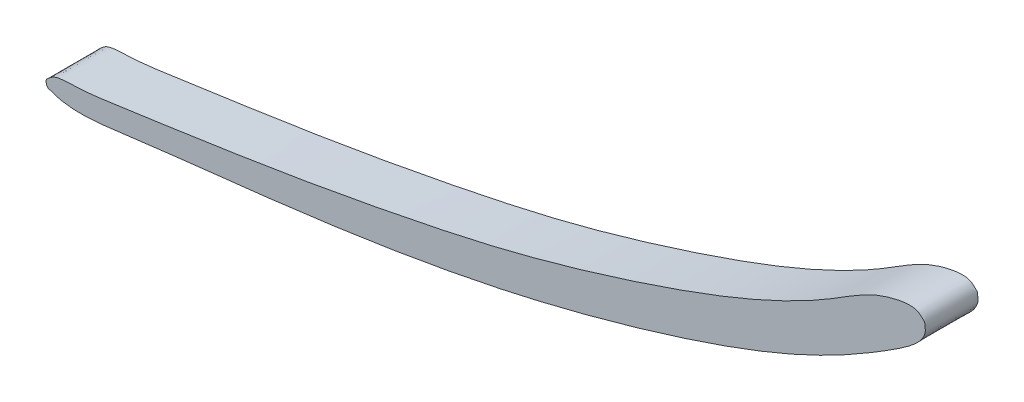
ISO-10303-21;
HEADER;
FILE_DESCRIPTION(('STEP AP214'),'2;1');
FILE_NAME('part.step','',(''),(''),'','','');
FILE_SCHEMA(('AUTOMOTIVE_DESIGN { 1 0 10303 214 1 1 1 1 }'));
ENDSEC;
DATA;
#1=APPLICATION_CONTEXT('core data for automotive mechanical design processes');
#2=APPLICATION_PROTOCOL_DEFINITION('international standard','automotive_design',2000,#1);
#3=PRODUCT_CONTEXT('',#1,'mechanical');
#4=PRODUCT('Part','Part','',(#3));
#5=PRODUCT_RELATED_PRODUCT_CATEGORY('part','',(#4));
#6=PRODUCT_DEFINITION_FORMATION('','',#4);
#7=PRODUCT_DEFINITION_CONTEXT('part definition',#1,'design');
#8=PRODUCT_DEFINITION('design','',#6,#7);
#9=PRODUCT_DEFINITION_SHAPE('','',#8);
#10=(LENGTH_UNIT() NAMED_UNIT(*) SI_UNIT(.MILLI.,.METRE.));
#11=(NAMED_UNIT(*) PLANE_ANGLE_UNIT() SI_UNIT($,.RADIAN.));
#12=(NAMED_UNIT(*) SI_UNIT($,.STERADIAN.) SOLID_ANGLE_UNIT());
#13=UNCERTAINTY_MEASURE_WITH_UNIT(LENGTH_MEASURE(1.E-05),#10,'distance_accuracy_value','');
#14=(GEOMETRIC_REPRESENTATION_CONTEXT(3) GLOBAL_UNCERTAINTY_ASSIGNED_CONTEXT((#13)) GLOBAL_UNIT_ASSIGNED_CONTEXT((#10,
#11,#12)) REPRESENTATION_CONTEXT('',''));
#15=CARTESIAN_POINT('',(0.,0.,0.));
#16=DIRECTION('',(0.,0.,1.));
#17=DIRECTION('',(1.,0.,0.));
#18=AXIS2_PLACEMENT_3D('',#15,#16,#17);
#19=CARTESIAN_POINT('',(80.3681662930312,0.,324.));
#20=CARTESIAN_POINT('',(80.3332922161662,0.0879752940058576,324.));
#21=CARTESIAN_POINT('',(80.2685826506996,0.156845551200729,324.));
#22=CARTESIAN_POINT('',(80.1343495821701,0.286544346547012,324.));
#23=CARTESIAN_POINT('',(80.0634697382039,0.347234187714516,324.));
#24=CARTESIAN_POINT('',(79.8547067438405,0.533588417553242,324.));
#25=CARTESIAN_POINT('',(79.7161343589074,0.660130375545312,324.));
#26=CARTESIAN_POINT('',(79.4906524435037,0.822556149189074,324.));
#27=CARTESIAN_POINT('',(79.4129908654656,0.87252916410502,324.));
#28=CARTESIAN_POINT('',(79.2485978659326,0.957356332931109,324.));
#29=CARTESIAN_POINT('',(79.1614047273396,0.992863665723763,324.));
#30=CARTESIAN_POINT('',(78.8937661149337,1.07901747163807,324.));
#31=CARTESIAN_POINT('',(78.7109322519051,1.10914701907117,324.));
#32=CARTESIAN_POINT('',(78.3409909899485,1.14293348736234,324.));
#33=CARTESIAN_POINT('',(78.1534366725936,1.14575699868746,324.));
#34=CARTESIAN_POINT('',(77.7826684676746,1.13765948760862,324.));
#35=CARTESIAN_POINT('',(77.5983165901293,1.12625628658208,324.));
#36=CARTESIAN_POINT('',(77.0480254796304,1.07234988382803,324.));
#37=CARTESIAN_POINT('',(76.684617642929,1.01181086889114,324.));
#38=CARTESIAN_POINT('',(75.9611166867751,0.867115982869691,324.));
#39=CARTESIAN_POINT('',(75.6002446763123,0.781156071941636,324.));
#40=CARTESIAN_POINT('',(74.8868480962219,0.587162028949001,324.));
#41=CARTESIAN_POINT('',(74.5348582527314,0.479774051609013,324.));
#42=CARTESIAN_POINT('',(73.4920898920143,0.128476780087926,324.));
#43=CARTESIAN_POINT('',(72.814993442137,-0.145627134765617,324.));
#44=CARTESIAN_POINT('',(70.835888140254,-1.08310258132398,324.));
#45=CARTESIAN_POINT('',(69.5812760274827,-1.85117373523442,324.));
#46=CARTESIAN_POINT('',(67.7074331691984,-3.02070546748365,324.));
#47=CARTESIAN_POINT('',(67.083529409527,-3.41209592928973,324.));
#48=CARTESIAN_POINT('',(65.828739713028,-4.17967925700701,324.));
#49=CARTESIAN_POINT('',(65.1984123778196,-4.55708799033158,324.));
#50=CARTESIAN_POINT('',(63.2916215948873,-5.65490437747468,324.));
#51=CARTESIAN_POINT('',(62.000130566435,-6.3426025920934,324.));
#52=CARTESIAN_POINT('',(59.3905309068326,-7.66006242642342,324.));
#53=CARTESIAN_POINT('',(58.0725258606504,-8.29004951198109,324.));
#54=CARTESIAN_POINT('',(55.4170246863835,-9.50759886635779,324.));
#55=CARTESIAN_POINT('',(54.0789451314043,-10.093891232397,324.));
#56=CARTESIAN_POINT('',(51.3822708672398,-11.2218221242261,324.));
#57=CARTESIAN_POINT('',(50.0240429664722,-11.7642590551518,324.));
#58=CARTESIAN_POINT('',(45.9264215446745,-13.3416429864623,324.));
#59=CARTESIAN_POINT('',(43.1646554326539,-14.329320211329,324.));
#60=CARTESIAN_POINT('',(37.6072340338468,-16.224900640075,324.));
#61=CARTESIAN_POINT('',(34.8139043640364,-17.1294820956699,324.));
#62=CARTESIAN_POINT('',(29.2054878147714,-18.8664425008462,324.));
#63=CARTESIAN_POINT('',(26.390843334939,-19.6985852392419,324.));
#64=CARTESIAN_POINT('',(20.7340633738239,-21.2671507429504,324.));
#65=CARTESIAN_POINT('',(17.8907561469061,-22.0028421256199,324.));
#66=CARTESIAN_POINT('',(12.181195972912,-23.3683627313171,324.));
#67=CARTESIAN_POINT('',(9.31514909595396,-24.0012788723005,324.));
#68=CARTESIAN_POINT('',(3.56897091598708,-25.2048017995811,324.));
#69=CARTESIAN_POINT('',(0.689295256648165,-25.7771257272051,324.));
#70=CARTESIAN_POINT('',(-5.07578044485798,-26.8878264918017,324.));
#71=CARTESIAN_POINT('',(-7.9623199888897,-27.4220620260696,324.));
#72=CARTESIAN_POINT('',(-13.7438504537859,-28.4459395875459,324.));
#73=CARTESIAN_POINT('',(-16.6388382823,-28.9327808597916,324.));
#74=CARTESIAN_POINT('',(-22.4358556841405,-29.8619517774227,324.));
#75=CARTESIAN_POINT('',(-25.3380656389695,-30.3038534363204,324.));
#76=CARTESIAN_POINT('',(-31.1458186134143,-31.1660498356122,324.));
#77=CARTESIAN_POINT('',(-34.0508875000237,-31.5890901024617,324.));
#78=CARTESIAN_POINT('',(-38.4094344310781,-32.217068841772,324.));
#79=CARTESIAN_POINT('',(-39.8624200295712,-32.4254538094014,324.));
#80=CARTESIAN_POINT('',(-42.0429693381293,-32.730451712722,324.));
#81=CARTESIAN_POINT('',(-42.7699651533263,-32.8310774784897,324.));
#82=CARTESIAN_POINT('',(-44.2241455226802,-33.0308727691224,324.));
#83=CARTESIAN_POINT('',(-44.9512064674475,-33.1309898063176,324.));
#84=CARTESIAN_POINT('',(-46.4093220283049,-33.3012587041316,324.));
#85=CARTESIAN_POINT('',(-47.1396586460287,-33.36973626199,324.));
#86=CARTESIAN_POINT('',(-48.2374412154866,-33.435870722634,324.));
#87=CARTESIAN_POINT('',(-48.6038238093206,-33.451005608214,324.));
#88=CARTESIAN_POINT('',(-49.3371941739843,-33.4720861838169,324.));
#89=CARTESIAN_POINT('',(-49.7043069667104,-33.4800332987999,324.));
#90=CARTESIAN_POINT('',(-50.4349606029914,-33.5251308070532,324.));
#91=CARTESIAN_POINT('',(-50.7988536005882,-33.5587103927075,324.));
#92=CARTESIAN_POINT('',(-51.3371587768028,-33.6670436614103,324.));
#93=CARTESIAN_POINT('',(-51.5170483865823,-33.7141380678849,324.));
#94=CARTESIAN_POINT('',(-51.862740245526,-33.840635048823,324.));
#95=CARTESIAN_POINT('',(-52.0267672836615,-33.9207440161551,324.));
#96=CARTESIAN_POINT('',(-52.336298539798,-34.1163749713912,324.));
#97=CARTESIAN_POINT('',(-52.483245168705,-34.2299052987435,324.));
#98=CARTESIAN_POINT('',(-52.6951944499742,-34.4087422892785,324.));
#99=CARTESIAN_POINT('',(-52.7662184858779,-34.4681309179263,324.));
#100=CARTESIAN_POINT('',(-52.9017899446751,-34.5933582177269,324.));
#101=CARTESIAN_POINT('',(-52.9693275146866,-34.6591509051646,324.));
#102=CARTESIAN_POINT('',(-53.0397011329861,-34.7781004947824,324.));
#103=CARTESIAN_POINT('',(-53.0568998238589,-34.8214991152693,324.));
#104=CARTESIAN_POINT('',(-53.0752367944463,-34.9128045498878,324.));
#105=CARTESIAN_POINT('',(-53.0772110961267,-34.9590074080593,324.));
#106=CARTESIAN_POINT('',(-53.0700520852565,-35.0986163596678,324.));
#107=CARTESIAN_POINT('',(-53.0501186870425,-35.1885223576265,324.));
#108=CARTESIAN_POINT('',(-53.0044100800903,-35.366151345376,324.));
#109=CARTESIAN_POINT('',(-52.9780078866022,-35.4550519163809,324.));
#110=CARTESIAN_POINT('',(-52.9146457609342,-35.5791521138046,324.));
#111=CARTESIAN_POINT('',(-52.889385150171,-35.6175502005167,324.));
#112=CARTESIAN_POINT('',(-52.8274541247658,-35.6861646188563,324.));
#113=CARTESIAN_POINT('',(-52.790721774627,-35.716219442193,324.));
#114=CARTESIAN_POINT('',(-52.6720203580192,-35.7859371658669,324.));
#115=CARTESIAN_POINT('',(-52.5809921650868,-35.8113156936606,324.));
#116=CARTESIAN_POINT('',(-52.4021842439574,-35.8620029256775,324.));
#117=CARTESIAN_POINT('',(-52.3130656321725,-35.8882278010575,324.));
#118=CARTESIAN_POINT('',(-52.0473341814662,-35.9719001310282,324.));
#119=CARTESIAN_POINT('',(-51.8726061466316,-36.0353617763469,324.));
#120=CARTESIAN_POINT('',(-51.5217203350962,-36.1569257415733,324.));
#121=CARTESIAN_POINT('',(-51.3456252308135,-36.2142328810324,324.));
#122=CARTESIAN_POINT('',(-50.9899638416216,-36.3103530849745,324.));
#123=CARTESIAN_POINT('',(-50.8106446882763,-36.3504828397036,324.));
#124=CARTESIAN_POINT('',(-50.2697115768245,-36.4550181549565,324.));
#125=CARTESIAN_POINT('',(-49.9049597539345,-36.5027055112696,324.));
#126=CARTESIAN_POINT('',(-49.1714250150643,-36.5766029958653,324.));
#127=CARTESIAN_POINT('',(-48.8017562033366,-36.6010113649196,324.));
#128=CARTESIAN_POINT('',(-47.6965991413182,-36.6396246998774,324.));
#129=CARTESIAN_POINT('',(-46.9618035114793,-36.618548757223,324.));
#130=CARTESIAN_POINT('',(-45.4943592108035,-36.5255215357745,324.));
#131=CARTESIAN_POINT('',(-44.7616250475714,-36.4555961244215,324.));
#132=CARTESIAN_POINT('',(-43.2970081274269,-36.2955699827349,324.));
#133=CARTESIAN_POINT('',(-42.5658246242849,-36.2056525477358,324.));
#134=CARTESIAN_POINT('',(-41.1039748982247,-36.0220717034061,324.));
#135=CARTESIAN_POINT('',(-40.3733946400649,-35.9274456491954,324.));
#136=CARTESIAN_POINT('',(-38.1813494517993,-35.6460842263817,324.));
#137=CARTESIAN_POINT('',(-36.7194953490411,-35.4625079932191,324.));
#138=CARTESIAN_POINT('',(-32.331335117484,-34.9329486663179,324.));
#139=CARTESIAN_POINT('',(-29.4027184330754,-34.6058566094856,324.));
#140=CARTESIAN_POINT('',(-23.5463158028321,-33.9451493866262,324.));
#141=CARTESIAN_POINT('',(-20.6185997503662,-33.6107132097997,324.));
#142=CARTESIAN_POINT('',(-14.768360770631,-32.8981505515783,324.));
#143=CARTESIAN_POINT('',(-11.8453671730002,-32.5208993957451,324.));
#144=CARTESIAN_POINT('',(-6.00833102389001,-31.7085965130094,324.));
#145=CARTESIAN_POINT('',(-3.09453196719177,-31.2726363077874,324.));
#146=CARTESIAN_POINT('',(5.63070337810566,-29.86266580108,324.));
#147=CARTESIAN_POINT('',(11.4281250398305,-28.7830128786137,324.));
#148=CARTESIAN_POINT('',(22.9387458067389,-26.2662408112458,324.));
#149=CARTESIAN_POINT('',(28.6567654231321,-24.8261455210969,324.));
#150=CARTESIAN_POINT('',(37.1621023664273,-22.4127277123044,324.));
#151=CARTESIAN_POINT('',(39.9858662121887,-21.566534693519,324.));
#152=CARTESIAN_POINT('',(45.6013487391972,-19.7854028903357,324.));
#153=CARTESIAN_POINT('',(48.39366288189,-18.8495857300987,324.));
#154=CARTESIAN_POINT('',(53.933056900862,-16.8452690047786,324.));
#155=CARTESIAN_POINT('',(56.682956029596,-15.7752787279938,324.));
#156=CARTESIAN_POINT('',(60.7419205317758,-14.0230223255074,324.));
#157=CARTESIAN_POINT('',(62.0839363203909,-13.4144113752521,324.));
#158=CARTESIAN_POINT('',(64.7429876400676,-12.1413535536193,324.));
#159=CARTESIAN_POINT('',(66.0601496706636,-11.4766949439121,324.));
#160=CARTESIAN_POINT('',(69.9643521814461,-9.39932650419335,324.));
#161=CARTESIAN_POINT('',(72.5079707932433,-7.901748818133,324.));
#162=CARTESIAN_POINT('',(75.6179662304141,-5.92203839335221,324.));
#163=CARTESIAN_POINT('',(76.2366504197336,-5.52079672757025,324.));
#164=CARTESIAN_POINT('',(77.1512600958639,-4.89875967899628,324.));
#165=CARTESIAN_POINT('',(77.4531976675691,-4.68737535863853,324.));
#166=CARTESIAN_POINT('',(78.0470608526542,-4.25081740922675,324.));
#167=CARTESIAN_POINT('',(78.3402590862171,-4.02583766722541,324.));
#168=CARTESIAN_POINT('',(78.9027989005038,-3.55159480384488,324.));
#169=CARTESIAN_POINT('',(79.1718272920894,-3.30256429455625,324.));
#170=CARTESIAN_POINT('',(79.5442062190221,-2.89870116928513,324.));
#171=CARTESIAN_POINT('',(79.663007177274,-2.7588993952298,324.));
#172=CARTESIAN_POINT('',(79.8863202996661,-2.46539508809473,324.));
#173=CARTESIAN_POINT('',(79.9910601501322,-2.31076172971561,324.));
#174=CARTESIAN_POINT('',(80.1795798619596,-1.99181153025727,324.));
#175=CARTESIAN_POINT('',(80.2640114745223,-1.82709426397243,324.));
#176=CARTESIAN_POINT('',(80.3979997175953,-1.47905819112557,324.));
#177=CARTESIAN_POINT('',(80.4464176781137,-1.30058264660064,324.));
#178=CARTESIAN_POINT('',(80.4682263139599,-1.02311729095879,324.));
#179=CARTESIAN_POINT('',(80.4662307478287,-0.928663852298156,324.));
#180=CARTESIAN_POINT('',(80.4529753658955,-0.742312433086723,324.));
#181=CARTESIAN_POINT('',(80.4415279279687,-0.649605732720179,324.));
#182=CARTESIAN_POINT('',(80.4209300988431,-0.463968806530826,324.));
#183=CARTESIAN_POINT('',(80.4146200493684,-0.370762187253792,324.));
#184=CARTESIAN_POINT('',(80.4069908633904,-0.230773608182732,324.));
#185=CARTESIAN_POINT('',(80.4048756577256,-0.18406911382309,324.));
#186=CARTESIAN_POINT('',(80.3945165705414,-0.0912565061219816,324.));
#187=CARTESIAN_POINT('',(80.3856033314636,-0.0439876470029203,324.));
#188=CARTESIAN_POINT('',(80.3681662930312,0.,324.));
#189=B_SPLINE_CURVE_WITH_KNOTS('',3,(#19,#20,#21,#22,#23,#24,#25,#26,#27,#28,#29,#30,#31,#32,
#33,#34,#35,#36,#37,#38,#39,#40,#41,#42,#43,#44,#45,#46,#47,#48,#49,#50,#51,#52,#53,#54,#55,#56,
#57,#58,#59,#60,#61,#62,#63,#64,#65,#66,#67,#68,#69,#70,#71,#72,#73,#74,#75,#76,#77,#78,#79,#80,
#81,#82,#83,#84,#85,#86,#87,#88,#89,#90,#91,#92,#93,#94,#95,#96,#97,#98,#99,#100,#101,#102,#103,
#104,#105,#106,#107,#108,#109,#110,#111,#112,#113,#114,#115,#116,#117,#118,#119,#120,#121,#122,
#123,#124,#125,#126,#127,#128,#129,#130,#131,#132,#133,#134,#135,#136,#137,#138,#139,#140,#141,
#142,#143,#144,#145,#146,#147,#148,#149,#150,#151,#152,#153,#154,#155,#156,#157,#158,#159,#160,
#161,#162,#163,#164,#165,#166,#167,#168,#169,#170,#171,#172,#173,#174,#175,#176,#177,#178,#179,
#180,#181,#182,#183,#184,#185,#186,#187,#188),.UNSPECIFIED.,.T.,.F.,(4,2,2,2,2,2,2,2,2,2,2,2,2,
2,2,2,2,2,2,2,2,2,2,2,2,2,2,2,2,2,2,2,2,2,2,2,2,2,2,2,2,2,2,2,2,2,2,2,2,2,2,2,2,2,2,2,2,2,2,2,2,
2,2,2,2,2,2,2,2,2,2,2,2,2,2,2,2,2,2,2,2,2,2,2,4),(0.,0.000976562499999912,0.00195312499999982,
0.00390624999999965,0.00488281249999962,0.00585937499999959,0.00781249999999954,
0.00976562499999948,0.0117187499999994,0.0156249999999995,0.0195312499999995,0.0234374999999995,
0.0312499999999997,0.0468750000000003,0.0546875000000006,0.062500000000001,0.0781250000000016,
0.0937500000000023,0.109375000000003,0.125000000000004,0.156250000000005,0.187500000000006,
0.218750000000008,0.250000000000009,0.281250000000011,0.312500000000012,0.343750000000014,
0.375000000000015,0.406250000000017,0.437500000000018,0.453125000000019,0.460937500000019,
0.468750000000019,0.47656250000002,0.48046875000002,0.48437500000002,0.48828125000002,
0.49023437500002,0.49218750000002,0.49414062500002,0.49511718750002,0.49609375000002,
0.49658203125002,0.49707031250002,0.49804687500002,0.49902343750002,0.49951171875002,
0.50000000000002,0.50097656250002,0.50195312500002,0.50390625000002,0.50585937500002,
0.50781250000002,0.51171875000002,0.51562500000002,0.523437500000019,0.531250000000019,
0.539062500000019,0.546875000000019,0.562500000000018,0.593750000000017,0.625000000000016,
0.656250000000014,0.687500000000013,0.75000000000001,0.812500000000008,0.843750000000007,
0.875000000000005,0.906250000000004,0.921875000000004,0.937500000000003,0.968750000000002,
0.976562500000001,0.980468750000001,0.984375000000001,0.98828125,0.990234375,0.9921875,
0.994140625,0.99609375,0.9970703125,0.998046875,0.9990234375,0.99951171875,1.),.UNSPECIFIED.);
#190=DIRECTION('',(0.,0.,-1.));
#191=VECTOR('',#190,1.);
#192=SURFACE_OF_LINEAR_EXTRUSION('',#189,#191);
#193=CARTESIAN_POINT('',(80.3681662930312,0.,324.));
#194=CARTESIAN_POINT('',(80.3856033314636,-0.0439876470029203,324.));
#195=CARTESIAN_POINT('',(80.3945165705414,-0.0912565061219816,324.));
#196=CARTESIAN_POINT('',(80.4048756577256,-0.18406911382309,324.));
#197=CARTESIAN_POINT('',(80.4069908633904,-0.230773608182732,324.));
#198=CARTESIAN_POINT('',(80.4146200493684,-0.370762187253792,324.));
#199=CARTESIAN_POINT('',(80.4209300988431,-0.463968806530826,324.));
#200=CARTESIAN_POINT('',(80.4415279279687,-0.649605732720179,324.));
#201=CARTESIAN_POINT('',(80.4529753658955,-0.742312433086723,324.));
#202=CARTESIAN_POINT('',(80.4662307478287,-0.928663852298156,324.));
#203=CARTESIAN_POINT('',(80.4682263139599,-1.02311729095879,324.));
#204=CARTESIAN_POINT('',(80.4464176781137,-1.30058264660064,324.));
#205=CARTESIAN_POINT('',(80.3979997175953,-1.47905819112557,324.));
#206=CARTESIAN_POINT('',(80.2640114745223,-1.82709426397243,324.));
#207=CARTESIAN_POINT('',(80.1795798619596,-1.99181153025727,324.));
#208=CARTESIAN_POINT('',(79.9910601501322,-2.31076172971561,324.));
#209=CARTESIAN_POINT('',(79.8863202996661,-2.46539508809473,324.));
#210=CARTESIAN_POINT('',(79.663007177274,-2.7588993952298,324.));
#211=CARTESIAN_POINT('',(79.5442062190221,-2.89870116928513,324.));
#212=CARTESIAN_POINT('',(79.1718272920894,-3.30256429455625,324.));
#213=CARTESIAN_POINT('',(78.9027989005038,-3.55159480384488,324.));
#214=CARTESIAN_POINT('',(78.3402590862171,-4.02583766722541,324.));
#215=CARTESIAN_POINT('',(78.0470608526542,-4.25081740922675,324.));
#216=CARTESIAN_POINT('',(77.4531976675691,-4.68737535863853,324.));
#217=CARTESIAN_POINT('',(77.1512600958639,-4.89875967899628,324.));
#218=CARTESIAN_POINT('',(76.2366504197336,-5.52079672757025,324.));
#219=CARTESIAN_POINT('',(75.6179662304141,-5.92203839335221,324.));
#220=CARTESIAN_POINT('',(72.5079707932433,-7.901748818133,324.));
#221=CARTESIAN_POINT('',(69.9643521814461,-9.39932650419335,324.));
#222=CARTESIAN_POINT('',(66.0601496706636,-11.4766949439121,324.));
#223=CARTESIAN_POINT('',(64.7429876400676,-12.1413535536193,324.));
#224=CARTESIAN_POINT('',(62.0839363203909,-13.4144113752521,324.));
#225=CARTESIAN_POINT('',(60.7419205317758,-14.0230223255074,324.));
#226=CARTESIAN_POINT('',(56.682956029596,-15.7752787279938,324.));
#227=CARTESIAN_POINT('',(53.933056900862,-16.8452690047786,324.));
#228=CARTESIAN_POINT('',(48.39366288189,-18.8495857300987,324.));
#229=CARTESIAN_POINT('',(45.6013487391972,-19.7854028903357,324.));
#230=CARTESIAN_POINT('',(39.9858662121887,-21.566534693519,324.));
#231=CARTESIAN_POINT('',(37.1621023664273,-22.4127277123044,324.));
#232=CARTESIAN_POINT('',(28.6567654231321,-24.8261455210969,324.));
#233=CARTESIAN_POINT('',(22.9387458067389,-26.2662408112458,324.));
#234=CARTESIAN_POINT('',(11.4281250398305,-28.7830128786137,324.));
#235=CARTESIAN_POINT('',(5.63070337810566,-29.86266580108,324.));
#236=CARTESIAN_POINT('',(-3.09453196719177,-31.2726363077874,324.));
#237=CARTESIAN_POINT('',(-6.00833102389001,-31.7085965130094,324.));
#238=CARTESIAN_POINT('',(-11.8453671730002,-32.5208993957451,324.));
#239=CARTESIAN_POINT('',(-14.768360770631,-32.8981505515783,324.));
#240=CARTESIAN_POINT('',(-20.6185997503662,-33.6107132097997,324.));
#241=CARTESIAN_POINT('',(-23.5463158028321,-33.9451493866262,324.));
#242=CARTESIAN_POINT('',(-29.4027184330754,-34.6058566094856,324.));
#243=CARTESIAN_POINT('',(-32.331335117484,-34.9329486663179,324.));
#244=CARTESIAN_POINT('',(-36.7194953490411,-35.4625079932191,324.));
#245=CARTESIAN_POINT('',(-38.1813494517993,-35.6460842263817,324.));
#246=CARTESIAN_POINT('',(-40.3733946400649,-35.9274456491954,324.));
#247=CARTESIAN_POINT('',(-41.1039748982247,-36.0220717034061,324.));
#248=CARTESIAN_POINT('',(-42.5658246242849,-36.2056525477358,324.));
#249=CARTESIAN_POINT('',(-43.2970081274269,-36.2955699827349,324.));
#250=CARTESIAN_POINT('',(-44.7616250475714,-36.4555961244215,324.));
#251=CARTESIAN_POINT('',(-45.4943592108035,-36.5255215357745,324.));
#252=CARTESIAN_POINT('',(-46.9618035114793,-36.618548757223,324.));
#253=CARTESIAN_POINT('',(-47.6965991413182,-36.6396246998774,324.));
#254=CARTESIAN_POINT('',(-48.8017562033366,-36.6010113649196,324.));
#255=CARTESIAN_POINT('',(-49.1714250150643,-36.5766029958653,324.));
#256=CARTESIAN_POINT('',(-49.9049597539345,-36.5027055112696,324.));
#257=CARTESIAN_POINT('',(-50.2697115768245,-36.4550181549565,324.));
#258=CARTESIAN_POINT('',(-50.8106446882763,-36.3504828397036,324.));
#259=CARTESIAN_POINT('',(-50.9899638416216,-36.3103530849745,324.));
#260=CARTESIAN_POINT('',(-51.3456252308135,-36.2142328810324,324.));
#261=CARTESIAN_POINT('',(-51.5217203350962,-36.1569257415733,324.));
#262=CARTESIAN_POINT('',(-51.8726061466316,-36.0353617763469,324.));
#263=CARTESIAN_POINT('',(-52.0473341814662,-35.9719001310282,324.));
#264=CARTESIAN_POINT('',(-52.3130656321725,-35.8882278010575,324.));
#265=CARTESIAN_POINT('',(-52.4021842439574,-35.8620029256775,324.));
#266=CARTESIAN_POINT('',(-52.5809921650868,-35.8113156936606,324.));
#267=CARTESIAN_POINT('',(-52.6720203580192,-35.7859371658669,324.));
#268=CARTESIAN_POINT('',(-52.790721774627,-35.716219442193,324.));
#269=CARTESIAN_POINT('',(-52.8274541247658,-35.6861646188563,324.));
#270=CARTESIAN_POINT('',(-52.889385150171,-35.6175502005167,324.));
#271=CARTESIAN_POINT('',(-52.9146457609342,-35.5791521138046,324.));
#272=CARTESIAN_POINT('',(-52.9780078866022,-35.4550519163809,324.));
#273=CARTESIAN_POINT('',(-53.0044100800903,-35.366151345376,324.));
#274=CARTESIAN_POINT('',(-53.0501186870425,-35.1885223576265,324.));
#275=CARTESIAN_POINT('',(-53.0700520852565,-35.0986163596678,324.));
#276=CARTESIAN_POINT('',(-53.0772110961267,-34.9590074080593,324.));
#277=CARTESIAN_POINT('',(-53.0752367944463,-34.9128045498878,324.));
#278=CARTESIAN_POINT('',(-53.0568998238589,-34.8214991152693,324.));
#279=CARTESIAN_POINT('',(-53.0397011329861,-34.7781004947824,324.));
#280=CARTESIAN_POINT('',(-52.9693275146866,-34.6591509051646,324.));
#281=CARTESIAN_POINT('',(-52.9017899446751,-34.5933582177269,324.));
#282=CARTESIAN_POINT('',(-52.7662184858779,-34.4681309179263,324.));
#283=CARTESIAN_POINT('',(-52.6951944499742,-34.4087422892785,324.));
#284=CARTESIAN_POINT('',(-52.483245168705,-34.2299052987435,324.));
#285=CARTESIAN_POINT('',(-52.336298539798,-34.1163749713912,324.));
#286=CARTESIAN_POINT('',(-52.0267672836615,-33.9207440161551,324.));
#287=CARTESIAN_POINT('',(-51.862740245526,-33.840635048823,324.));
#288=CARTESIAN_POINT('',(-51.5170483865823,-33.7141380678849,324.));
#289=CARTESIAN_POINT('',(-51.3371587768028,-33.6670436614103,324.));
#290=CARTESIAN_POINT('',(-50.7988536005882,-33.5587103927075,324.));
#291=CARTESIAN_POINT('',(-50.4349606029914,-33.5251308070532,324.));
#292=CARTESIAN_POINT('',(-49.7043069667104,-33.4800332987999,324.));
#293=CARTESIAN_POINT('',(-49.3371941739843,-33.4720861838169,324.));
#294=CARTESIAN_POINT('',(-48.6038238093206,-33.451005608214,324.));
#295=CARTESIAN_POINT('',(-48.2374412154866,-33.435870722634,324.));
#296=CARTESIAN_POINT('',(-47.1396586460287,-33.36973626199,324.));
#297=CARTESIAN_POINT('',(-46.4093220283049,-33.3012587041316,324.));
#298=CARTESIAN_POINT('',(-44.9512064674475,-33.1309898063176,324.));
#299=CARTESIAN_POINT('',(-44.2241455226802,-33.0308727691224,324.));
#300=CARTESIAN_POINT('',(-42.7699651533263,-32.8310774784897,324.));
#301=CARTESIAN_POINT('',(-42.0429693381293,-32.730451712722,324.));
#302=CARTESIAN_POINT('',(-39.8624200295712,-32.4254538094014,324.));
#303=CARTESIAN_POINT('',(-38.4094344310781,-32.217068841772,324.));
#304=CARTESIAN_POINT('',(-34.0508875000237,-31.5890901024617,324.));
#305=CARTESIAN_POINT('',(-31.1458186134143,-31.1660498356122,324.));
#306=CARTESIAN_POINT('',(-25.3380656389695,-30.3038534363204,324.));
#307=CARTESIAN_POINT('',(-22.4358556841405,-29.8619517774227,324.));
#308=CARTESIAN_POINT('',(-16.6388382823,-28.9327808597916,324.));
#309=CARTESIAN_POINT('',(-13.7438504537859,-28.4459395875459,324.));
#310=CARTESIAN_POINT('',(-7.9623199888897,-27.4220620260696,324.));
#311=CARTESIAN_POINT('',(-5.07578044485798,-26.8878264918017,324.));
#312=CARTESIAN_POINT('',(0.689295256648165,-25.7771257272051,324.));
#313=CARTESIAN_POINT('',(3.56897091598708,-25.2048017995811,324.));
#314=CARTESIAN_POINT('',(9.31514909595396,-24.0012788723005,324.));
#315=CARTESIAN_POINT('',(12.181195972912,-23.3683627313171,324.));
#316=CARTESIAN_POINT('',(17.8907561469061,-22.0028421256199,324.));
#317=CARTESIAN_POINT('',(20.7340633738239,-21.2671507429504,324.));
#318=CARTESIAN_POINT('',(26.390843334939,-19.6985852392419,324.));
#319=CARTESIAN_POINT('',(29.2054878147714,-18.8664425008462,324.));
#320=CARTESIAN_POINT('',(34.8139043640364,-17.1294820956699,324.));
#321=CARTESIAN_POINT('',(37.6072340338468,-16.224900640075,324.));
#322=CARTESIAN_POINT('',(43.1646554326539,-14.329320211329,324.));
#323=CARTESIAN_POINT('',(45.9264215446745,-13.3416429864623,324.));
#324=CARTESIAN_POINT('',(50.0240429664722,-11.7642590551518,324.));
#325=CARTESIAN_POINT('',(51.3822708672398,-11.2218221242261,324.));
#326=CARTESIAN_POINT('',(54.0789451314043,-10.093891232397,324.));
#327=CARTESIAN_POINT('',(55.4170246863835,-9.50759886635779,324.));
#328=CARTESIAN_POINT('',(58.0725258606504,-8.29004951198109,324.));
#329=CARTESIAN_POINT('',(59.3905309068326,-7.66006242642342,324.));
#330=CARTESIAN_POINT('',(62.000130566435,-6.3426025920934,324.));
#331=CARTESIAN_POINT('',(63.2916215948873,-5.65490437747468,324.));
#332=CARTESIAN_POINT('',(65.1984123778196,-4.55708799033158,324.));
#333=CARTESIAN_POINT('',(65.828739713028,-4.17967925700701,324.));
#334=CARTESIAN_POINT('',(67.083529409527,-3.41209592928973,324.));
#335=CARTESIAN_POINT('',(67.7074331691984,-3.02070546748365,324.));
#336=CARTESIAN_POINT('',(69.5812760274827,-1.85117373523442,324.));
#337=CARTESIAN_POINT('',(70.835888140254,-1.08310258132398,324.));
#338=CARTESIAN_POINT('',(72.814993442137,-0.145627134765617,324.));
#339=CARTESIAN_POINT('',(73.4920898920143,0.128476780087926,324.));
#340=CARTESIAN_POINT('',(74.5348582527314,0.479774051609013,324.));
#341=CARTESIAN_POINT('',(74.8868480962219,0.587162028949001,324.));
#342=CARTESIAN_POINT('',(75.6002446763123,0.781156071941636,324.));
#343=CARTESIAN_POINT('',(75.9611166867751,0.867115982869691,324.));
#344=CARTESIAN_POINT('',(76.684617642929,1.01181086889114,324.));
#345=CARTESIAN_POINT('',(77.0480254796304,1.07234988382803,324.));
#346=CARTESIAN_POINT('',(77.5983165901293,1.12625628658208,324.));
#347=CARTESIAN_POINT('',(77.7826684676746,1.13765948760862,324.));
#348=CARTESIAN_POINT('',(78.1534366725936,1.14575699868746,324.));
#349=CARTESIAN_POINT('',(78.3409909899485,1.14293348736234,324.));
#350=CARTESIAN_POINT('',(78.7109322519051,1.10914701907117,324.));
#351=CARTESIAN_POINT('',(78.8937661149337,1.07901747163807,324.));
#352=CARTESIAN_POINT('',(79.1614047273396,0.992863665723763,324.));
#353=CARTESIAN_POINT('',(79.2485978659326,0.957356332931109,324.));
#354=CARTESIAN_POINT('',(79.4129908654656,0.87252916410502,324.));
#355=CARTESIAN_POINT('',(79.4906524435037,0.822556149189074,324.));
#356=CARTESIAN_POINT('',(79.7161343589074,0.660130375545312,324.));
#357=CARTESIAN_POINT('',(79.8547067438405,0.533588417553242,324.));
#358=CARTESIAN_POINT('',(80.0634697382039,0.347234187714516,324.));
#359=CARTESIAN_POINT('',(80.1343495821701,0.286544346547012,324.));
#360=CARTESIAN_POINT('',(80.2685826506996,0.156845551200729,324.));
#361=CARTESIAN_POINT('',(80.3332922161662,0.0879752940058576,324.));
#362=CARTESIAN_POINT('',(80.3681662930312,0.,324.));
#363=B_SPLINE_CURVE_WITH_KNOTS('',3,(#193,#194,#195,#196,#197,#198,#199,#200,#201,#202,#203,
#204,#205,#206,#207,#208,#209,#210,#211,#212,#213,#214,#215,#216,#217,#218,#219,#220,#221,#222,
#223,#224,#225,#226,#227,#228,#229,#230,#231,#232,#233,#234,#235,#236,#237,#238,#239,#240,#241,
#242,#243,#244,#245,#246,#247,#248,#249,#250,#251,#252,#253,#254,#255,#256,#257,#258,#259,#260,
#261,#262,#263,#264,#265,#266,#267,#268,#269,#270,#271,#272,#273,#274,#275,#276,#277,#278,#279,
#280,#281,#282,#283,#284,#285,#286,#287,#288,#289,#290,#291,#292,#293,#294,#295,#296,#297,#298,
#299,#300,#301,#302,#303,#304,#305,#306,#307,#308,#309,#310,#311,#312,#313,#314,#315,#316,#317,
#318,#319,#320,#321,#322,#323,#324,#325,#326,#327,#328,#329,#330,#331,#332,#333,#334,#335,#336,
#337,#338,#339,#340,#341,#342,#343,#344,#345,#346,#347,#348,#349,#350,#351,#352,#353,#354,#355,
#356,#357,#358,#359,#360,#361,#362),.UNSPECIFIED.,.T.,.F.,(4,2,2,2,2,2,2,2,2,2,2,2,2,2,2,2,2,2,
2,2,2,2,2,2,2,2,2,2,2,2,2,2,2,2,2,2,2,2,2,2,2,2,2,2,2,2,2,2,2,2,2,2,2,2,2,2,2,2,2,2,2,2,2,2,2,2,
2,2,2,2,2,2,2,2,2,2,2,2,2,2,2,2,2,2,4),(0.,0.000488281250000111,0.0009765625,
0.00195312499999989,0.00292968749999989,0.00390624999999978,0.00585937499999967,
0.00781249999999967,0.00976562499999956,0.0117187499999996,0.0156249999999992,0.019531249999999,
0.0234374999999988,0.0312499999999984,0.062499999999997,0.0781249999999964,0.0937499999999958,
0.124999999999995,0.156249999999993,0.187499999999992,0.24999999999999,0.312499999999987,
0.343749999999986,0.374999999999984,0.406249999999983,0.437499999999982,0.453124999999981,
0.460937499999981,0.468749999999981,0.476562499999981,0.48437499999998,0.48828124999998,
0.49218749999998,0.49414062499998,0.49609374999998,0.49804687499998,0.49902343749998,
0.49999999999998,0.50048828124998,0.50097656249998,0.50195312499998,0.50292968749998,
0.50341796874998,0.50390624999998,0.50488281249998,0.50585937499998,0.50781249999998,
0.50976562499998,0.51171874999998,0.51562499999998,0.51953124999998,0.52343749999998,
0.531249999999981,0.539062499999981,0.546874999999981,0.562499999999982,0.593749999999983,
0.624999999999985,0.656249999999986,0.687499999999988,0.718749999999989,0.749999999999991,
0.781249999999992,0.812499999999994,0.843749999999995,0.874999999999996,0.890624999999997,
0.906249999999998,0.921874999999998,0.937499999999999,0.945312499999999,0.953125,0.96875,
0.9765625,0.980468750000001,0.984375000000001,0.988281250000001,0.990234375000001,0.9921875,
0.994140625,0.9951171875,0.99609375,0.998046875,0.9990234375,1.),.UNSPECIFIED.);
#364=CARTESIAN_POINT('',(80.3681662930312,0.,324.));
#365=VERTEX_POINT('',#364);
#366=EDGE_CURVE('E10',#365,#365,#363,.F.);
#367=ORIENTED_EDGE('',*,*,#366,.F.);
#368=EDGE_LOOP('',(#367));
#369=FACE_BOUND('',#368,.T.);
#370=CARTESIAN_POINT('',(80.3681662930312,0.,316.));
#371=CARTESIAN_POINT('',(80.3332922161662,0.0879752940058576,316.));
#372=CARTESIAN_POINT('',(80.2685826506996,0.156845551200729,316.));
#373=CARTESIAN_POINT('',(80.1343495821701,0.286544346547012,316.));
#374=CARTESIAN_POINT('',(80.0634697382039,0.347234187714516,316.));
#375=CARTESIAN_POINT('',(79.8547067438405,0.533588417553242,316.));
#376=CARTESIAN_POINT('',(79.7161343589074,0.660130375545312,316.));
#377=CARTESIAN_POINT('',(79.4906524435037,0.822556149189074,316.));
#378=CARTESIAN_POINT('',(79.4129908654656,0.87252916410502,316.));
#379=CARTESIAN_POINT('',(79.2485978659326,0.957356332931109,316.));
#380=CARTESIAN_POINT('',(79.1614047273396,0.992863665723763,316.));
#381=CARTESIAN_POINT('',(78.8937661149337,1.07901747163807,316.));
#382=CARTESIAN_POINT('',(78.7109322519051,1.10914701907117,316.));
#383=CARTESIAN_POINT('',(78.3409909899485,1.14293348736234,316.));
#384=CARTESIAN_POINT('',(78.1534366725936,1.14575699868746,316.));
#385=CARTESIAN_POINT('',(77.7826684676746,1.13765948760862,316.));
#386=CARTESIAN_POINT('',(77.5983165901293,1.12625628658208,316.));
#387=CARTESIAN_POINT('',(77.0480254796304,1.07234988382803,316.));
#388=CARTESIAN_POINT('',(76.684617642929,1.01181086889114,316.));
#389=CARTESIAN_POINT('',(75.9611166867751,0.867115982869691,316.));
#390=CARTESIAN_POINT('',(75.6002446763123,0.781156071941636,316.));
#391=CARTESIAN_POINT('',(74.8868480962219,0.587162028949001,316.));
#392=CARTESIAN_POINT('',(74.5348582527314,0.479774051609013,316.));
#393=CARTESIAN_POINT('',(73.4920898920143,0.128476780087926,316.));
#394=CARTESIAN_POINT('',(72.814993442137,-0.145627134765617,316.));
#395=CARTESIAN_POINT('',(70.835888140254,-1.08310258132398,316.));
#396=CARTESIAN_POINT('',(69.5812760274827,-1.85117373523442,316.));
#397=CARTESIAN_POINT('',(67.7074331691984,-3.02070546748365,316.));
#398=CARTESIAN_POINT('',(67.083529409527,-3.41209592928973,316.));
#399=CARTESIAN_POINT('',(65.828739713028,-4.17967925700701,316.));
#400=CARTESIAN_POINT('',(65.1984123778196,-4.55708799033158,316.));
#401=CARTESIAN_POINT('',(63.2916215948873,-5.65490437747468,316.));
#402=CARTESIAN_POINT('',(62.000130566435,-6.3426025920934,316.));
#403=CARTESIAN_POINT('',(59.3905309068326,-7.66006242642342,316.));
#404=CARTESIAN_POINT('',(58.0725258606504,-8.29004951198109,316.));
#405=CARTESIAN_POINT('',(55.4170246863835,-9.50759886635779,316.));
#406=CARTESIAN_POINT('',(54.0789451314043,-10.093891232397,316.));
#407=CARTESIAN_POINT('',(51.3822708672398,-11.2218221242261,316.));
#408=CARTESIAN_POINT('',(50.0240429664722,-11.7642590551518,316.));
#409=CARTESIAN_POINT('',(45.9264215446745,-13.3416429864623,316.));
#410=CARTESIAN_POINT('',(43.1646554326539,-14.329320211329,316.));
#411=CARTESIAN_POINT('',(37.6072340338468,-16.224900640075,316.));
#412=CARTESIAN_POINT('',(34.8139043640364,-17.1294820956699,316.));
#413=CARTESIAN_POINT('',(29.2054878147714,-18.8664425008462,316.));
#414=CARTESIAN_POINT('',(26.390843334939,-19.6985852392419,316.));
#415=CARTESIAN_POINT('',(20.7340633738239,-21.2671507429504,316.));
#416=CARTESIAN_POINT('',(17.8907561469061,-22.0028421256199,316.));
#417=CARTESIAN_POINT('',(12.181195972912,-23.3683627313171,316.));
#418=CARTESIAN_POINT('',(9.31514909595396,-24.0012788723005,316.));
#419=CARTESIAN_POINT('',(3.56897091598708,-25.2048017995811,316.));
#420=CARTESIAN_POINT('',(0.689295256648165,-25.7771257272051,316.));
#421=CARTESIAN_POINT('',(-5.07578044485798,-26.8878264918017,316.));
#422=CARTESIAN_POINT('',(-7.9623199888897,-27.4220620260696,316.));
#423=CARTESIAN_POINT('',(-13.7438504537859,-28.4459395875459,316.));
#424=CARTESIAN_POINT('',(-16.6388382823,-28.9327808597916,316.));
#425=CARTESIAN_POINT('',(-22.4358556841405,-29.8619517774227,316.));
#426=CARTESIAN_POINT('',(-25.3380656389695,-30.3038534363204,316.));
#427=CARTESIAN_POINT('',(-31.1458186134143,-31.1660498356122,316.));
#428=CARTESIAN_POINT('',(-34.0508875000237,-31.5890901024617,316.));
#429=CARTESIAN_POINT('',(-38.4094344310781,-32.217068841772,316.));
#430=CARTESIAN_POINT('',(-39.8624200295712,-32.4254538094014,316.));
#431=CARTESIAN_POINT('',(-42.0429693381293,-32.730451712722,316.));
#432=CARTESIAN_POINT('',(-42.7699651533263,-32.8310774784897,316.));
#433=CARTESIAN_POINT('',(-44.2241455226802,-33.0308727691224,316.));
#434=CARTESIAN_POINT('',(-44.9512064674475,-33.1309898063176,316.));
#435=CARTESIAN_POINT('',(-46.4093220283049,-33.3012587041316,316.));
#436=CARTESIAN_POINT('',(-47.1396586460287,-33.36973626199,316.));
#437=CARTESIAN_POINT('',(-48.2374412154866,-33.435870722634,316.));
#438=CARTESIAN_POINT('',(-48.6038238093206,-33.451005608214,316.));
#439=CARTESIAN_POINT('',(-49.3371941739843,-33.4720861838169,316.));
#440=CARTESIAN_POINT('',(-49.7043069667104,-33.4800332987999,316.));
#441=CARTESIAN_POINT('',(-50.4349606029914,-33.5251308070532,316.));
#442=CARTESIAN_POINT('',(-50.7988536005882,-33.5587103927075,316.));
#443=CARTESIAN_POINT('',(-51.3371587768028,-33.6670436614103,316.));
#444=CARTESIAN_POINT('',(-51.5170483865823,-33.7141380678849,316.));
#445=CARTESIAN_POINT('',(-51.862740245526,-33.840635048823,316.));
#446=CARTESIAN_POINT('',(-52.0267672836615,-33.9207440161551,316.));
#447=CARTESIAN_POINT('',(-52.336298539798,-34.1163749713912,316.));
#448=CARTESIAN_POINT('',(-52.483245168705,-34.2299052987435,316.));
#449=CARTESIAN_POINT('',(-52.6951944499742,-34.4087422892785,316.));
#450=CARTESIAN_POINT('',(-52.7662184858779,-34.4681309179263,316.));
#451=CARTESIAN_POINT('',(-52.9017899446751,-34.5933582177269,316.));
#452=CARTESIAN_POINT('',(-52.9693275146866,-34.6591509051646,316.));
#453=CARTESIAN_POINT('',(-53.0397011329861,-34.7781004947824,316.));
#454=CARTESIAN_POINT('',(-53.0568998238589,-34.8214991152693,316.));
#455=CARTESIAN_POINT('',(-53.0752367944463,-34.9128045498878,316.));
#456=CARTESIAN_POINT('',(-53.0772110961267,-34.9590074080593,316.));
#457=CARTESIAN_POINT('',(-53.0700520852565,-35.0986163596678,316.));
#458=CARTESIAN_POINT('',(-53.0501186870425,-35.1885223576265,316.));
#459=CARTESIAN_POINT('',(-53.0044100800903,-35.366151345376,316.));
#460=CARTESIAN_POINT('',(-52.9780078866022,-35.4550519163809,316.));
#461=CARTESIAN_POINT('',(-52.9146457609342,-35.5791521138046,316.));
#462=CARTESIAN_POINT('',(-52.889385150171,-35.6175502005167,316.));
#463=CARTESIAN_POINT('',(-52.8274541247658,-35.6861646188563,316.));
#464=CARTESIAN_POINT('',(-52.790721774627,-35.716219442193,316.));
#465=CARTESIAN_POINT('',(-52.6720203580192,-35.7859371658669,316.));
#466=CARTESIAN_POINT('',(-52.5809921650868,-35.8113156936606,316.));
#467=CARTESIAN_POINT('',(-52.4021842439574,-35.8620029256775,316.));
#468=CARTESIAN_POINT('',(-52.3130656321725,-35.8882278010575,316.));
#469=CARTESIAN_POINT('',(-52.0473341814662,-35.9719001310282,316.));
#470=CARTESIAN_POINT('',(-51.8726061466316,-36.0353617763469,316.));
#471=CARTESIAN_POINT('',(-51.5217203350962,-36.1569257415733,316.));
#472=CARTESIAN_POINT('',(-51.3456252308135,-36.2142328810324,316.));
#473=CARTESIAN_POINT('',(-50.9899638416216,-36.3103530849745,316.));
#474=CARTESIAN_POINT('',(-50.8106446882763,-36.3504828397036,316.));
#475=CARTESIAN_POINT('',(-50.2697115768245,-36.4550181549565,316.));
#476=CARTESIAN_POINT('',(-49.9049597539345,-36.5027055112696,316.));
#477=CARTESIAN_POINT('',(-49.1714250150643,-36.5766029958653,316.));
#478=CARTESIAN_POINT('',(-48.8017562033366,-36.6010113649196,316.));
#479=CARTESIAN_POINT('',(-47.6965991413182,-36.6396246998774,316.));
#480=CARTESIAN_POINT('',(-46.9618035114793,-36.618548757223,316.));
#481=CARTESIAN_POINT('',(-45.4943592108035,-36.5255215357745,316.));
#482=CARTESIAN_POINT('',(-44.7616250475714,-36.4555961244215,316.));
#483=CARTESIAN_POINT('',(-43.2970081274269,-36.2955699827349,316.));
#484=CARTESIAN_POINT('',(-42.5658246242849,-36.2056525477358,316.));
#485=CARTESIAN_POINT('',(-41.1039748982247,-36.0220717034061,316.));
#486=CARTESIAN_POINT('',(-40.3733946400649,-35.9274456491954,316.));
#487=CARTESIAN_POINT('',(-38.1813494517993,-35.6460842263817,316.));
#488=CARTESIAN_POINT('',(-36.7194953490411,-35.4625079932191,316.));
#489=CARTESIAN_POINT('',(-32.331335117484,-34.9329486663179,316.));
#490=CARTESIAN_POINT('',(-29.4027184330754,-34.6058566094856,316.));
#491=CARTESIAN_POINT('',(-23.5463158028321,-33.9451493866262,316.));
#492=CARTESIAN_POINT('',(-20.6185997503662,-33.6107132097997,316.));
#493=CARTESIAN_POINT('',(-14.768360770631,-32.8981505515783,316.));
#494=CARTESIAN_POINT('',(-11.8453671730002,-32.5208993957451,316.));
#495=CARTESIAN_POINT('',(-6.00833102389001,-31.7085965130094,316.));
#496=CARTESIAN_POINT('',(-3.09453196719177,-31.2726363077874,316.));
#497=CARTESIAN_POINT('',(5.63070337810566,-29.86266580108,316.));
#498=CARTESIAN_POINT('',(11.4281250398305,-28.7830128786137,316.));
#499=CARTESIAN_POINT('',(22.9387458067389,-26.2662408112458,316.));
#500=CARTESIAN_POINT('',(28.6567654231321,-24.8261455210969,316.));
#501=CARTESIAN_POINT('',(37.1621023664273,-22.4127277123044,316.));
#502=CARTESIAN_POINT('',(39.9858662121887,-21.566534693519,316.));
#503=CARTESIAN_POINT('',(45.6013487391972,-19.7854028903357,316.));
#504=CARTESIAN_POINT('',(48.39366288189,-18.8495857300987,316.));
#505=CARTESIAN_POINT('',(53.933056900862,-16.8452690047786,316.));
#506=CARTESIAN_POINT('',(56.682956029596,-15.7752787279938,316.));
#507=CARTESIAN_POINT('',(60.7419205317758,-14.0230223255074,316.));
#508=CARTESIAN_POINT('',(62.0839363203909,-13.4144113752521,316.));
#509=CARTESIAN_POINT('',(64.7429876400676,-12.1413535536193,316.));
#510=CARTESIAN_POINT('',(66.0601496706636,-11.4766949439121,316.));
#511=CARTESIAN_POINT('',(69.9643521814461,-9.39932650419335,316.));
#512=CARTESIAN_POINT('',(72.5079707932433,-7.901748818133,316.));
#513=CARTESIAN_POINT('',(75.6179662304141,-5.92203839335221,316.));
#514=CARTESIAN_POINT('',(76.2366504197336,-5.52079672757025,316.));
#515=CARTESIAN_POINT('',(77.1512600958639,-4.89875967899628,316.));
#516=CARTESIAN_POINT('',(77.4531976675691,-4.68737535863853,316.));
#517=CARTESIAN_POINT('',(78.0470608526542,-4.25081740922675,316.));
#518=CARTESIAN_POINT('',(78.3402590862171,-4.02583766722541,316.));
#519=CARTESIAN_POINT('',(78.9027989005038,-3.55159480384488,316.));
#520=CARTESIAN_POINT('',(79.1718272920894,-3.30256429455625,316.));
#521=CARTESIAN_POINT('',(79.5442062190221,-2.89870116928513,316.));
#522=CARTESIAN_POINT('',(79.663007177274,-2.7588993952298,316.));
#523=CARTESIAN_POINT('',(79.8863202996661,-2.46539508809473,316.));
#524=CARTESIAN_POINT('',(79.9910601501322,-2.31076172971561,316.));
#525=CARTESIAN_POINT('',(80.1795798619596,-1.99181153025727,316.));
#526=CARTESIAN_POINT('',(80.2640114745223,-1.82709426397243,316.));
#527=CARTESIAN_POINT('',(80.3979997175953,-1.47905819112557,316.));
#528=CARTESIAN_POINT('',(80.4464176781137,-1.30058264660064,316.));
#529=CARTESIAN_POINT('',(80.4682263139599,-1.02311729095879,316.));
#530=CARTESIAN_POINT('',(80.4662307478287,-0.928663852298156,316.));
#531=CARTESIAN_POINT('',(80.4529753658955,-0.742312433086723,316.));
#532=CARTESIAN_POINT('',(80.4415279279687,-0.649605732720179,316.));
#533=CARTESIAN_POINT('',(80.4209300988431,-0.463968806530826,316.));
#534=CARTESIAN_POINT('',(80.4146200493684,-0.370762187253792,316.));
#535=CARTESIAN_POINT('',(80.4069908633904,-0.230773608182732,316.));
#536=CARTESIAN_POINT('',(80.4048756577256,-0.18406911382309,316.));
#537=CARTESIAN_POINT('',(80.3945165705414,-0.0912565061219816,316.));
#538=CARTESIAN_POINT('',(80.3856033314636,-0.0439876470029203,316.));
#539=CARTESIAN_POINT('',(80.3681662930312,0.,316.));
#540=B_SPLINE_CURVE_WITH_KNOTS('',3,(#370,#371,#372,#373,#374,#375,#376,#377,#378,#379,#380,
#381,#382,#383,#384,#385,#386,#387,#388,#389,#390,#391,#392,#393,#394,#395,#396,#397,#398,#399,
#400,#401,#402,#403,#404,#405,#406,#407,#408,#409,#410,#411,#412,#413,#414,#415,#416,#417,#418,
#419,#420,#421,#422,#423,#424,#425,#426,#427,#428,#429,#430,#431,#432,#433,#434,#435,#436,#437,
#438,#439,#440,#441,#442,#443,#444,#445,#446,#447,#448,#449,#450,#451,#452,#453,#454,#455,#456,
#457,#458,#459,#460,#461,#462,#463,#464,#465,#466,#467,#468,#469,#470,#471,#472,#473,#474,#475,
#476,#477,#478,#479,#480,#481,#482,#483,#484,#485,#486,#487,#488,#489,#490,#491,#492,#493,#494,
#495,#496,#497,#498,#499,#500,#501,#502,#503,#504,#505,#506,#507,#508,#509,#510,#511,#512,#513,
#514,#515,#516,#517,#518,#519,#520,#521,#522,#523,#524,#525,#526,#527,#528,#529,#530,#531,#532,
#533,#534,#535,#536,#537,#538,#539),.UNSPECIFIED.,.T.,.F.,(4,2,2,2,2,2,2,2,2,2,2,2,2,2,2,2,2,2,
2,2,2,2,2,2,2,2,2,2,2,2,2,2,2,2,2,2,2,2,2,2,2,2,2,2,2,2,2,2,2,2,2,2,2,2,2,2,2,2,2,2,2,2,2,2,2,2,
2,2,2,2,2,2,2,2,2,2,2,2,2,2,2,2,2,2,4),(0.,0.000976562499999912,0.00195312499999982,
0.00390624999999965,0.00488281249999962,0.00585937499999959,0.00781249999999954,
0.00976562499999948,0.0117187499999994,0.0156249999999995,0.0195312499999995,0.0234374999999995,
0.0312499999999997,0.0468750000000003,0.0546875000000006,0.062500000000001,0.0781250000000016,
0.0937500000000023,0.109375000000003,0.125000000000004,0.156250000000005,0.187500000000006,
0.218750000000008,0.250000000000009,0.281250000000011,0.312500000000012,0.343750000000014,
0.375000000000015,0.406250000000017,0.437500000000018,0.453125000000019,0.460937500000019,
0.468750000000019,0.47656250000002,0.48046875000002,0.48437500000002,0.48828125000002,
0.49023437500002,0.49218750000002,0.49414062500002,0.49511718750002,0.49609375000002,
0.49658203125002,0.49707031250002,0.49804687500002,0.49902343750002,0.49951171875002,
0.50000000000002,0.50097656250002,0.50195312500002,0.50390625000002,0.50585937500002,
0.50781250000002,0.51171875000002,0.51562500000002,0.523437500000019,0.531250000000019,
0.539062500000019,0.546875000000019,0.562500000000018,0.593750000000017,0.625000000000016,
0.656250000000014,0.687500000000013,0.75000000000001,0.812500000000008,0.843750000000007,
0.875000000000005,0.906250000000004,0.921875000000004,0.937500000000003,0.968750000000002,
0.976562500000001,0.980468750000001,0.984375000000001,0.98828125,0.990234375,0.9921875,
0.994140625,0.99609375,0.9970703125,0.998046875,0.9990234375,0.99951171875,1.),.UNSPECIFIED.);
#541=CARTESIAN_POINT('',(80.3681662930312,0.,316.));
#542=VERTEX_POINT('',#541);
#543=EDGE_CURVE('E38',#542,#542,#540,.T.);
#544=ORIENTED_EDGE('',*,*,#543,.T.);
#545=EDGE_LOOP('',(#544));
#546=FACE_BOUND('',#545,.T.);
#547=ADVANCED_FACE('F28',(#369,#546),#192,.F.);
#548=CARTESIAN_POINT('',(-52.7511546357626,-35.7394586834148,324.));
#549=DIRECTION('',(0.,0.,-1.));
#550=DIRECTION('',(-1.,0.,0.));
#551=AXIS2_PLACEMENT_3D('',#548,#549,#550);
#552=PLANE('',#551);
#553=ORIENTED_EDGE('',*,*,#366,.T.);
#554=EDGE_LOOP('',(#553));
#555=FACE_BOUND('',#554,.T.);
#556=ADVANCED_FACE('F69',(#555),#552,.F.);
#557=CARTESIAN_POINT('',(-52.7511546357626,-35.7394586834148,316.));
#558=DIRECTION('',(0.,0.,-1.));
#559=DIRECTION('',(-1.,0.,0.));
#560=AXIS2_PLACEMENT_3D('',#557,#558,#559);
#561=PLANE('',#560);
#562=ORIENTED_EDGE('',*,*,#543,.F.);
#563=EDGE_LOOP('',(#562));
#564=FACE_BOUND('',#563,.T.);
#565=ADVANCED_FACE('F77',(#564),#561,.T.);
#566=CLOSED_SHELL('',(#547,#556,#565));
#567=MANIFOLD_SOLID_BREP('B2',#566);
#568=ADVANCED_BREP_SHAPE_REPRESENTATION('',(#18,#567),#14);
#569=SHAPE_DEFINITION_REPRESENTATION(#9,#568);
ENDSEC;
END-ISO-10303-21;
